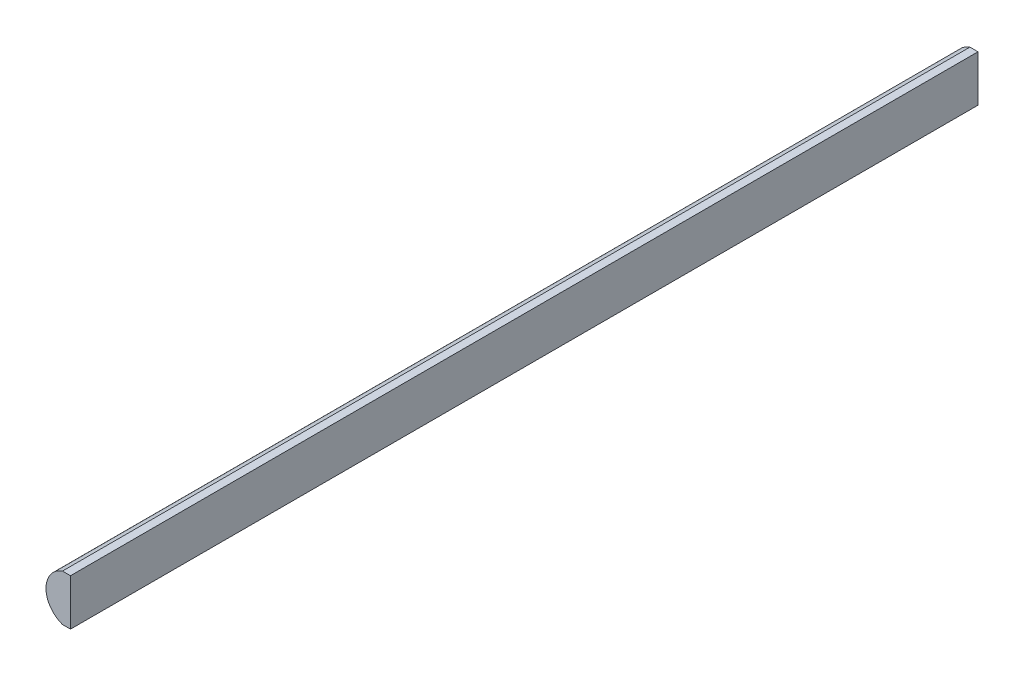
ISO-10303-21;
HEADER;
FILE_DESCRIPTION(('STEP AP214'),'2;1');
FILE_NAME('part.step','',(''),(''),'','','');
FILE_SCHEMA(('AUTOMOTIVE_DESIGN { 1 0 10303 214 1 1 1 1 }'));
ENDSEC;
DATA;
#1=APPLICATION_CONTEXT('core data for automotive mechanical design processes');
#2=APPLICATION_PROTOCOL_DEFINITION('international standard','automotive_design',2000,#1);
#3=PRODUCT_CONTEXT('',#1,'mechanical');
#4=PRODUCT('Part','Part','',(#3));
#5=PRODUCT_RELATED_PRODUCT_CATEGORY('part','',(#4));
#6=PRODUCT_DEFINITION_FORMATION('','',#4);
#7=PRODUCT_DEFINITION_CONTEXT('part definition',#1,'design');
#8=PRODUCT_DEFINITION('design','',#6,#7);
#9=PRODUCT_DEFINITION_SHAPE('','',#8);
#10=(LENGTH_UNIT() NAMED_UNIT(*) SI_UNIT(.MILLI.,.METRE.));
#11=(NAMED_UNIT(*) PLANE_ANGLE_UNIT() SI_UNIT($,.RADIAN.));
#12=(NAMED_UNIT(*) SI_UNIT($,.STERADIAN.) SOLID_ANGLE_UNIT());
#13=UNCERTAINTY_MEASURE_WITH_UNIT(LENGTH_MEASURE(1.E-05),#10,'distance_accuracy_value','');
#14=(GEOMETRIC_REPRESENTATION_CONTEXT(3) GLOBAL_UNCERTAINTY_ASSIGNED_CONTEXT((#13)) GLOBAL_UNIT_ASSIGNED_CONTEXT((#10,
#11,#12)) REPRESENTATION_CONTEXT('',''));
#15=CARTESIAN_POINT('',(0.,0.,0.));
#16=DIRECTION('',(0.,0.,1.));
#17=DIRECTION('',(1.,0.,0.));
#18=AXIS2_PLACEMENT_3D('',#15,#16,#17);
#19=CARTESIAN_POINT('',(0.,2.55,100.));
#20=DIRECTION('',(-1.,0.,0.));
#21=DIRECTION('',(0.,-1.,0.));
#22=AXIS2_PLACEMENT_3D('',#19,#20,#21);
#23=PLANE('',#22);
#24=DIRECTION('',(0.,1.,0.));
#25=VECTOR('',#24,1.);
#26=CARTESIAN_POINT('',(0.,2.55,0.));
#27=LINE('',#26,#25);
#28=CARTESIAN_POINT('',(0.,-2.55,0.));
#29=VERTEX_POINT('',#28);
#30=CARTESIAN_POINT('',(0.,2.55,0.));
#31=VERTEX_POINT('',#30);
#32=EDGE_CURVE('E117',#29,#31,#27,.T.);
#33=ORIENTED_EDGE('',*,*,#32,.T.);
#34=DIRECTION('',(0.,0.,-1.));
#35=VECTOR('',#34,1.);
#36=CARTESIAN_POINT('',(0.,2.55,100.));
#37=LINE('',#36,#35);
#38=CARTESIAN_POINT('',(0.,2.55,100.));
#39=VERTEX_POINT('',#38);
#40=EDGE_CURVE('E11',#39,#31,#37,.T.);
#41=ORIENTED_EDGE('',*,*,#40,.F.);
#42=DIRECTION('',(0.,1.,0.));
#43=VECTOR('',#42,1.);
#44=CARTESIAN_POINT('',(0.,2.55,100.));
#45=LINE('',#44,#43);
#46=CARTESIAN_POINT('',(0.,-2.55,100.));
#47=VERTEX_POINT('',#46);
#48=EDGE_CURVE('E100',#47,#39,#45,.T.);
#49=ORIENTED_EDGE('',*,*,#48,.F.);
#50=DIRECTION('',(0.,0.,-1.));
#51=VECTOR('',#50,1.);
#52=CARTESIAN_POINT('',(0.,-2.55,100.));
#53=LINE('',#52,#51);
#54=EDGE_CURVE('E113',#47,#29,#53,.T.);
#55=ORIENTED_EDGE('',*,*,#54,.T.);
#56=EDGE_LOOP('',(#33,#41,#49,#55));
#57=FACE_BOUND('',#56,.T.);
#58=ADVANCED_FACE('F40',(#57),#23,.F.);
#59=CARTESIAN_POINT('',(0.,2.55,100.));
#60=DIRECTION('',(0.,-1.,0.));
#61=DIRECTION('',(1.,0.,0.));
#62=AXIS2_PLACEMENT_3D('',#59,#60,#61);
#63=PLANE('',#62);
#64=DIRECTION('',(-1.,0.,0.));
#65=VECTOR('',#64,1.);
#66=CARTESIAN_POINT('',(0.,2.55,0.));
#67=LINE('',#66,#65);
#68=CARTESIAN_POINT('',(-0.887411967464942,2.55,0.));
#69=VERTEX_POINT('',#68);
#70=EDGE_CURVE('E105',#31,#69,#67,.T.);
#71=ORIENTED_EDGE('',*,*,#70,.T.);
#72=DIRECTION('',(0.,0.,-1.));
#73=VECTOR('',#72,1.);
#74=CARTESIAN_POINT('',(-0.887411967464942,2.55,100.));
#75=LINE('',#74,#73);
#76=CARTESIAN_POINT('',(-0.887411967464942,2.55,100.));
#77=VERTEX_POINT('',#76);
#78=EDGE_CURVE('E49',#77,#69,#75,.T.);
#79=ORIENTED_EDGE('',*,*,#78,.F.);
#80=DIRECTION('',(-1.,0.,0.));
#81=VECTOR('',#80,1.);
#82=CARTESIAN_POINT('',(0.,2.55,100.));
#83=LINE('',#82,#81);
#84=EDGE_CURVE('E94',#39,#77,#83,.T.);
#85=ORIENTED_EDGE('',*,*,#84,.F.);
#86=ORIENTED_EDGE('',*,*,#40,.T.);
#87=EDGE_LOOP('',(#71,#79,#85,#86));
#88=FACE_BOUND('',#87,.T.);
#89=ADVANCED_FACE('F104',(#88),#63,.F.);
#90=CARTESIAN_POINT('',(0.,0.,100.));
#91=DIRECTION('',(0.,0.,-1.));
#92=DIRECTION('',(-1.,0.,0.));
#93=AXIS2_PLACEMENT_3D('',#90,#91,#92);
#94=CYLINDRICAL_SURFACE('',#93,2.7);
#95=CARTESIAN_POINT('',(0.,0.,0.));
#96=DIRECTION('',(0.,0.,1.));
#97=DIRECTION('',(-1.,0.,0.));
#98=AXIS2_PLACEMENT_3D('',#95,#96,#97);
#99=CIRCLE('',#98,2.7);
#100=CARTESIAN_POINT('',(-0.887411967464935,-2.54999999999999,0.));
#101=VERTEX_POINT('',#100);
#102=EDGE_CURVE('E80',#69,#101,#99,.T.);
#103=ORIENTED_EDGE('',*,*,#102,.T.);
#104=DIRECTION('',(0.,0.,-1.));
#105=VECTOR('',#104,1.);
#106=CARTESIAN_POINT('',(-0.887411967464935,-2.54999999999999,100.));
#107=LINE('',#106,#105);
#108=CARTESIAN_POINT('',(-0.887411967464935,-2.54999999999999,100.));
#109=VERTEX_POINT('',#108);
#110=EDGE_CURVE('E107',#109,#101,#107,.T.);
#111=ORIENTED_EDGE('',*,*,#110,.F.);
#112=CARTESIAN_POINT('',(0.,0.,100.));
#113=DIRECTION('',(0.,0.,1.));
#114=DIRECTION('',(-1.,0.,0.));
#115=AXIS2_PLACEMENT_3D('',#112,#113,#114);
#116=CIRCLE('',#115,2.7);
#117=EDGE_CURVE('E98',#77,#109,#116,.T.);
#118=ORIENTED_EDGE('',*,*,#117,.F.);
#119=ORIENTED_EDGE('',*,*,#78,.T.);
#120=EDGE_LOOP('',(#103,#111,#118,#119));
#121=FACE_BOUND('',#120,.T.);
#122=ADVANCED_FACE('F108',(#121),#94,.T.);
#123=CARTESIAN_POINT('',(0.,-2.55,100.));
#124=DIRECTION('',(0.,1.,0.));
#125=DIRECTION('',(-1.,0.,0.));
#126=AXIS2_PLACEMENT_3D('',#123,#124,#125);
#127=PLANE('',#126);
#128=DIRECTION('',(1.,0.,0.));
#129=VECTOR('',#128,1.);
#130=CARTESIAN_POINT('',(0.,-2.55,0.));
#131=LINE('',#130,#129);
#132=EDGE_CURVE('E87',#101,#29,#131,.T.);
#133=ORIENTED_EDGE('',*,*,#132,.T.);
#134=ORIENTED_EDGE('',*,*,#54,.F.);
#135=DIRECTION('',(1.,0.,0.));
#136=VECTOR('',#135,1.);
#137=CARTESIAN_POINT('',(0.,-2.55,100.));
#138=LINE('',#137,#136);
#139=EDGE_CURVE('E59',#109,#47,#138,.T.);
#140=ORIENTED_EDGE('',*,*,#139,.F.);
#141=ORIENTED_EDGE('',*,*,#110,.T.);
#142=EDGE_LOOP('',(#133,#134,#140,#141));
#143=FACE_BOUND('',#142,.T.);
#144=ADVANCED_FACE('F129',(#143),#127,.F.);
#145=CARTESIAN_POINT('',(0.,0.,100.));
#146=DIRECTION('',(0.,0.,-1.));
#147=DIRECTION('',(-1.,0.,0.));
#148=AXIS2_PLACEMENT_3D('',#145,#146,#147);
#149=PLANE('',#148);
#150=ORIENTED_EDGE('',*,*,#48,.T.);
#151=ORIENTED_EDGE('',*,*,#84,.T.);
#152=ORIENTED_EDGE('',*,*,#117,.T.);
#153=ORIENTED_EDGE('',*,*,#139,.T.);
#154=EDGE_LOOP('',(#150,#151,#152,#153));
#155=FACE_BOUND('',#154,.T.);
#156=ADVANCED_FACE('F96',(#155),#149,.F.);
#157=CARTESIAN_POINT('',(0.,0.,0.));
#158=DIRECTION('',(0.,0.,-1.));
#159=DIRECTION('',(-1.,0.,0.));
#160=AXIS2_PLACEMENT_3D('',#157,#158,#159);
#161=PLANE('',#160);
#162=ORIENTED_EDGE('',*,*,#32,.F.);
#163=ORIENTED_EDGE('',*,*,#132,.F.);
#164=ORIENTED_EDGE('',*,*,#102,.F.);
#165=ORIENTED_EDGE('',*,*,#70,.F.);
#166=EDGE_LOOP('',(#162,#163,#164,#165));
#167=FACE_BOUND('',#166,.T.);
#168=ADVANCED_FACE('F132',(#167),#161,.T.);
#169=CLOSED_SHELL('',(#58,#89,#122,#144,#156,#168));
#170=MANIFOLD_SOLID_BREP('B2',#169);
#171=ADVANCED_BREP_SHAPE_REPRESENTATION('',(#18,#170),#14);
#172=SHAPE_DEFINITION_REPRESENTATION(#9,#171);
ENDSEC;
END-ISO-10303-21;
